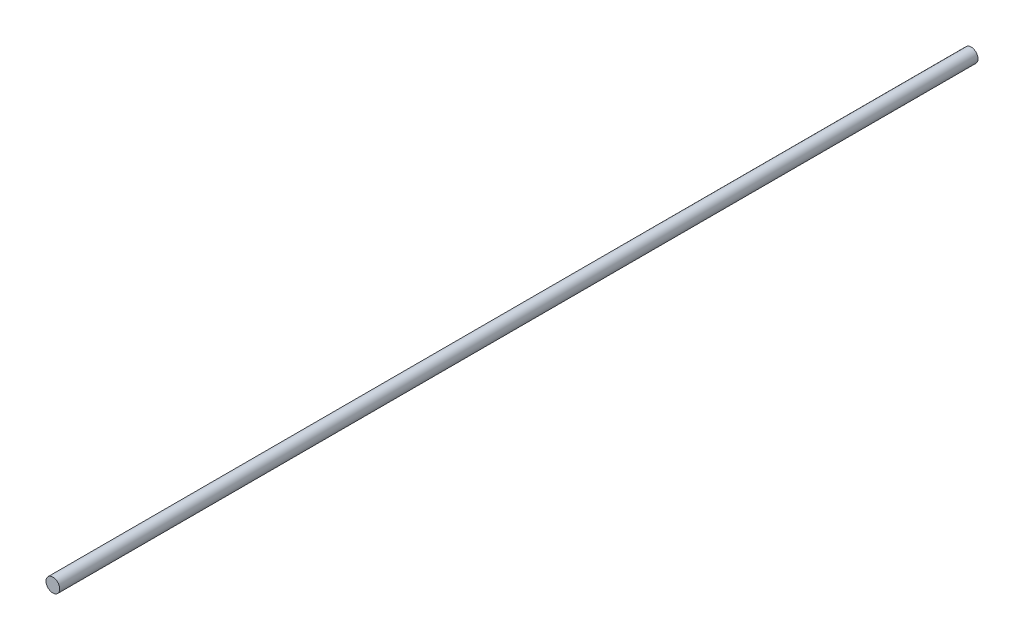
ISO-10303-21;
HEADER;
FILE_DESCRIPTION(('STEP AP214'),'2;1');
FILE_NAME('part.step','',(''),(''),'','','');
FILE_SCHEMA(('AUTOMOTIVE_DESIGN { 1 0 10303 214 1 1 1 1 }'));
ENDSEC;
DATA;
#1=APPLICATION_CONTEXT('core data for automotive mechanical design processes');
#2=APPLICATION_PROTOCOL_DEFINITION('international standard','automotive_design',2000,#1);
#3=PRODUCT_CONTEXT('',#1,'mechanical');
#4=PRODUCT('Part','Part','',(#3));
#5=PRODUCT_RELATED_PRODUCT_CATEGORY('part','',(#4));
#6=PRODUCT_DEFINITION_FORMATION('','',#4);
#7=PRODUCT_DEFINITION_CONTEXT('part definition',#1,'design');
#8=PRODUCT_DEFINITION('design','',#6,#7);
#9=PRODUCT_DEFINITION_SHAPE('','',#8);
#10=(LENGTH_UNIT() NAMED_UNIT(*) SI_UNIT(.MILLI.,.METRE.));
#11=(NAMED_UNIT(*) PLANE_ANGLE_UNIT() SI_UNIT($,.RADIAN.));
#12=(NAMED_UNIT(*) SI_UNIT($,.STERADIAN.) SOLID_ANGLE_UNIT());
#13=UNCERTAINTY_MEASURE_WITH_UNIT(LENGTH_MEASURE(1.E-05),#10,'distance_accuracy_value','');
#14=(GEOMETRIC_REPRESENTATION_CONTEXT(3) GLOBAL_UNCERTAINTY_ASSIGNED_CONTEXT((#13)) GLOBAL_UNIT_ASSIGNED_CONTEXT((#10,
#11,#12)) REPRESENTATION_CONTEXT('',''));
#15=CARTESIAN_POINT('',(0.,0.,0.));
#16=DIRECTION('',(0.,0.,1.));
#17=DIRECTION('',(1.,0.,0.));
#18=AXIS2_PLACEMENT_3D('',#15,#16,#17);
#19=CARTESIAN_POINT('',(0.,0.,2000.));
#20=DIRECTION('',(0.,0.,-1.));
#21=DIRECTION('',(-1.,0.,0.));
#22=AXIS2_PLACEMENT_3D('',#19,#20,#21);
#23=CYLINDRICAL_SURFACE('',#22,15.);
#24=CARTESIAN_POINT('',(0.,0.,2000.));
#25=DIRECTION('',(0.,0.,1.));
#26=DIRECTION('',(1.,0.,0.));
#27=AXIS2_PLACEMENT_3D('',#24,#25,#26);
#28=CIRCLE('',#27,15.);
#29=CARTESIAN_POINT('',(15.,0.,2000.));
#30=VERTEX_POINT('',#29);
#31=EDGE_CURVE('E10',#30,#30,#28,.T.);
#32=ORIENTED_EDGE('',*,*,#31,.F.);
#33=EDGE_LOOP('',(#32));
#34=FACE_BOUND('',#33,.T.);
#35=CARTESIAN_POINT('',(0.,0.,0.));
#36=DIRECTION('',(0.,0.,1.));
#37=DIRECTION('',(1.,0.,0.));
#38=AXIS2_PLACEMENT_3D('',#35,#36,#37);
#39=CIRCLE('',#38,15.);
#40=CARTESIAN_POINT('',(15.,0.,0.));
#41=VERTEX_POINT('',#40);
#42=EDGE_CURVE('E40',#41,#41,#39,.T.);
#43=ORIENTED_EDGE('',*,*,#42,.T.);
#44=EDGE_LOOP('',(#43));
#45=FACE_BOUND('',#44,.T.);
#46=ADVANCED_FACE('F37',(#34,#45),#23,.T.);
#47=CARTESIAN_POINT('',(0.,0.,2000.));
#48=DIRECTION('',(0.,0.,1.));
#49=DIRECTION('',(1.,0.,0.));
#50=AXIS2_PLACEMENT_3D('',#47,#48,#49);
#51=PLANE('',#50);
#52=ORIENTED_EDGE('',*,*,#31,.T.);
#53=EDGE_LOOP('',(#52));
#54=FACE_BOUND('',#53,.T.);
#55=ADVANCED_FACE('F54',(#54),#51,.T.);
#56=CARTESIAN_POINT('',(0.,0.,0.));
#57=DIRECTION('',(0.,0.,1.));
#58=DIRECTION('',(1.,0.,0.));
#59=AXIS2_PLACEMENT_3D('',#56,#57,#58);
#60=PLANE('',#59);
#61=ORIENTED_EDGE('',*,*,#42,.F.);
#62=EDGE_LOOP('',(#61));
#63=FACE_BOUND('',#62,.T.);
#64=ADVANCED_FACE('F52',(#63),#60,.F.);
#65=CLOSED_SHELL('',(#46,#55,#64));
#66=MANIFOLD_SOLID_BREP('B2',#65);
#67=ADVANCED_BREP_SHAPE_REPRESENTATION('',(#18,#66),#14);
#68=SHAPE_DEFINITION_REPRESENTATION(#9,#67);
ENDSEC;
END-ISO-10303-21;
